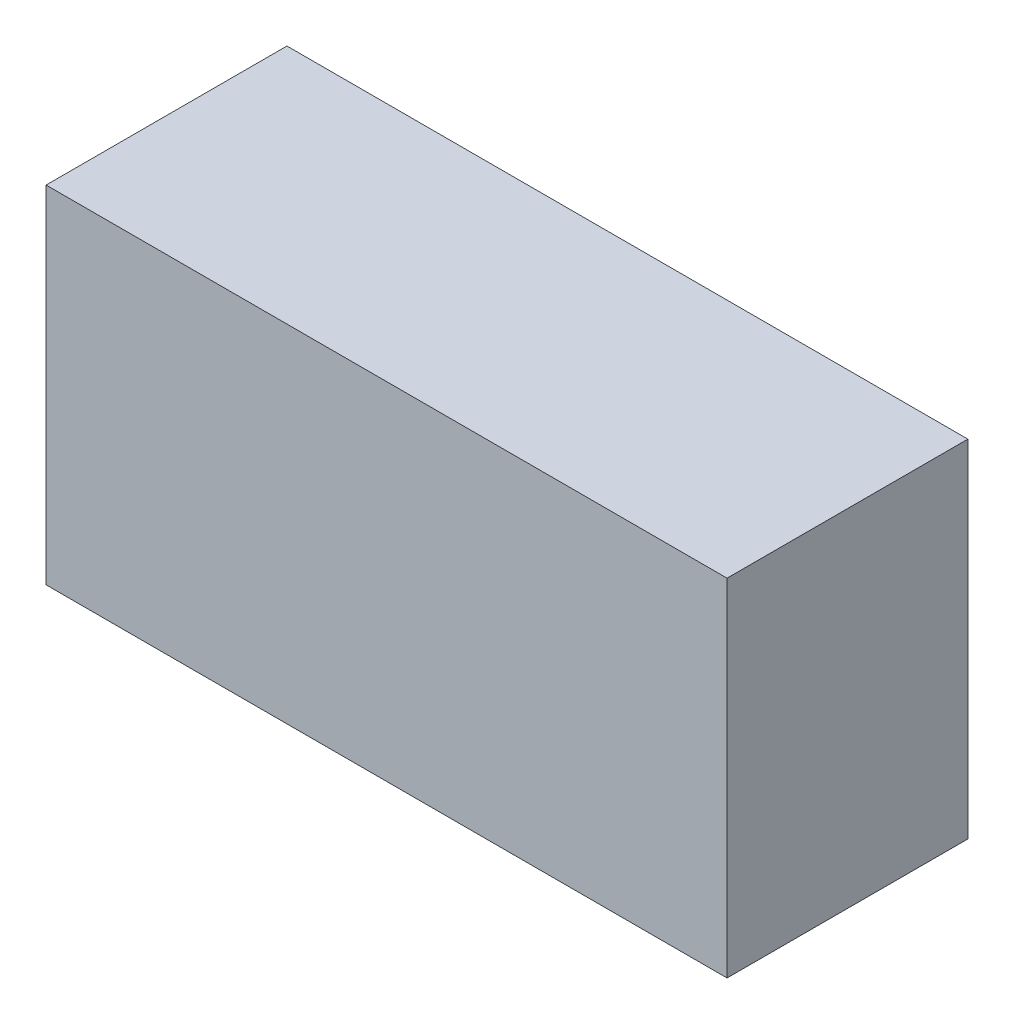
ISO-10303-21;
HEADER;
FILE_DESCRIPTION(('STEP AP214'),'2;1');
FILE_NAME('part.step','',(''),(''),'','','');
FILE_SCHEMA(('AUTOMOTIVE_DESIGN { 1 0 10303 214 1 1 1 1 }'));
ENDSEC;
DATA;
#1=APPLICATION_CONTEXT('core data for automotive mechanical design processes');
#2=APPLICATION_PROTOCOL_DEFINITION('international standard','automotive_design',2000,#1);
#3=PRODUCT_CONTEXT('',#1,'mechanical');
#4=PRODUCT('Part','Part','',(#3));
#5=PRODUCT_RELATED_PRODUCT_CATEGORY('part','',(#4));
#6=PRODUCT_DEFINITION_FORMATION('','',#4);
#7=PRODUCT_DEFINITION_CONTEXT('part definition',#1,'design');
#8=PRODUCT_DEFINITION('design','',#6,#7);
#9=PRODUCT_DEFINITION_SHAPE('','',#8);
#10=(LENGTH_UNIT() NAMED_UNIT(*) SI_UNIT(.MILLI.,.METRE.));
#11=(NAMED_UNIT(*) PLANE_ANGLE_UNIT() SI_UNIT($,.RADIAN.));
#12=(NAMED_UNIT(*) SI_UNIT($,.STERADIAN.) SOLID_ANGLE_UNIT());
#13=UNCERTAINTY_MEASURE_WITH_UNIT(LENGTH_MEASURE(1.E-05),#10,'distance_accuracy_value','');
#14=(GEOMETRIC_REPRESENTATION_CONTEXT(3) GLOBAL_UNCERTAINTY_ASSIGNED_CONTEXT((#13)) GLOBAL_UNIT_ASSIGNED_CONTEXT((#10,
#11,#12)) REPRESENTATION_CONTEXT('',''));
#15=CARTESIAN_POINT('',(0.,0.,0.));
#16=DIRECTION('',(0.,0.,1.));
#17=DIRECTION('',(1.,0.,0.));
#18=AXIS2_PLACEMENT_3D('',#15,#16,#17);
#19=CARTESIAN_POINT('',(0.,41.7,0.));
#20=DIRECTION('',(1.,0.,0.));
#21=DIRECTION('',(0.,0.,-1.));
#22=AXIS2_PLACEMENT_3D('',#19,#20,#21);
#23=PLANE('',#22);
#24=DIRECTION('',(0.,0.,1.));
#25=VECTOR('',#24,1.);
#26=CARTESIAN_POINT('',(0.,0.,0.));
#27=LINE('',#26,#25);
#28=CARTESIAN_POINT('',(0.,0.,-29.));
#29=VERTEX_POINT('',#28);
#30=CARTESIAN_POINT('',(0.,0.,0.));
#31=VERTEX_POINT('',#30);
#32=EDGE_CURVE('E113',#29,#31,#27,.T.);
#33=ORIENTED_EDGE('',*,*,#32,.T.);
#34=DIRECTION('',(0.,-1.,0.));
#35=VECTOR('',#34,1.);
#36=CARTESIAN_POINT('',(0.,41.7,0.));
#37=LINE('',#36,#35);
#38=CARTESIAN_POINT('',(0.,41.7,0.));
#39=VERTEX_POINT('',#38);
#40=EDGE_CURVE('E11',#39,#31,#37,.T.);
#41=ORIENTED_EDGE('',*,*,#40,.F.);
#42=DIRECTION('',(0.,0.,1.));
#43=VECTOR('',#42,1.);
#44=CARTESIAN_POINT('',(0.,41.7,0.));
#45=LINE('',#44,#43);
#46=CARTESIAN_POINT('',(0.,41.7,-29.));
#47=VERTEX_POINT('',#46);
#48=EDGE_CURVE('E97',#47,#39,#45,.T.);
#49=ORIENTED_EDGE('',*,*,#48,.F.);
#50=DIRECTION('',(0.,-1.,0.));
#51=VECTOR('',#50,1.);
#52=CARTESIAN_POINT('',(0.,41.7,-29.));
#53=LINE('',#52,#51);
#54=EDGE_CURVE('E109',#47,#29,#53,.T.);
#55=ORIENTED_EDGE('',*,*,#54,.T.);
#56=EDGE_LOOP('',(#33,#41,#49,#55));
#57=FACE_BOUND('',#56,.T.);
#58=ADVANCED_FACE('F45',(#57),#23,.F.);
#59=CARTESIAN_POINT('',(0.,41.7,0.));
#60=DIRECTION('',(0.,0.,-1.));
#61=DIRECTION('',(-1.,0.,0.));
#62=AXIS2_PLACEMENT_3D('',#59,#60,#61);
#63=PLANE('',#62);
#64=DIRECTION('',(1.,0.,0.));
#65=VECTOR('',#64,1.);
#66=CARTESIAN_POINT('',(0.,0.,0.));
#67=LINE('',#66,#65);
#68=CARTESIAN_POINT('',(82.,0.,0.));
#69=VERTEX_POINT('',#68);
#70=EDGE_CURVE('E102',#31,#69,#67,.T.);
#71=ORIENTED_EDGE('',*,*,#70,.T.);
#72=DIRECTION('',(0.,-1.,0.));
#73=VECTOR('',#72,1.);
#74=CARTESIAN_POINT('',(82.,41.7,0.));
#75=LINE('',#74,#73);
#76=CARTESIAN_POINT('',(82.,41.7,0.));
#77=VERTEX_POINT('',#76);
#78=EDGE_CURVE('E54',#77,#69,#75,.T.);
#79=ORIENTED_EDGE('',*,*,#78,.F.);
#80=DIRECTION('',(1.,0.,0.));
#81=VECTOR('',#80,1.);
#82=CARTESIAN_POINT('',(0.,41.7,0.));
#83=LINE('',#82,#81);
#84=EDGE_CURVE('E92',#39,#77,#83,.T.);
#85=ORIENTED_EDGE('',*,*,#84,.F.);
#86=ORIENTED_EDGE('',*,*,#40,.T.);
#87=EDGE_LOOP('',(#71,#79,#85,#86));
#88=FACE_BOUND('',#87,.T.);
#89=ADVANCED_FACE('F101',(#88),#63,.F.);
#90=CARTESIAN_POINT('',(82.,41.7,0.));
#91=DIRECTION('',(-1.,0.,0.));
#92=DIRECTION('',(0.,0.,1.));
#93=AXIS2_PLACEMENT_3D('',#90,#91,#92);
#94=PLANE('',#93);
#95=DIRECTION('',(0.,0.,-1.));
#96=VECTOR('',#95,1.);
#97=CARTESIAN_POINT('',(82.,0.,0.));
#98=LINE('',#97,#96);
#99=CARTESIAN_POINT('',(82.,0.,-29.));
#100=VERTEX_POINT('',#99);
#101=EDGE_CURVE('E79',#69,#100,#98,.T.);
#102=ORIENTED_EDGE('',*,*,#101,.T.);
#103=DIRECTION('',(0.,-1.,0.));
#104=VECTOR('',#103,1.);
#105=CARTESIAN_POINT('',(82.,41.7,-29.));
#106=LINE('',#105,#104);
#107=CARTESIAN_POINT('',(82.,41.7,-29.));
#108=VERTEX_POINT('',#107);
#109=EDGE_CURVE('E104',#108,#100,#106,.T.);
#110=ORIENTED_EDGE('',*,*,#109,.F.);
#111=DIRECTION('',(0.,0.,-1.));
#112=VECTOR('',#111,1.);
#113=CARTESIAN_POINT('',(82.,41.7,0.));
#114=LINE('',#113,#112);
#115=EDGE_CURVE('E95',#77,#108,#114,.T.);
#116=ORIENTED_EDGE('',*,*,#115,.F.);
#117=ORIENTED_EDGE('',*,*,#78,.T.);
#118=EDGE_LOOP('',(#102,#110,#116,#117));
#119=FACE_BOUND('',#118,.T.);
#120=ADVANCED_FACE('F105',(#119),#94,.F.);
#121=CARTESIAN_POINT('',(0.,41.7,-29.));
#122=DIRECTION('',(0.,0.,1.));
#123=DIRECTION('',(1.,0.,0.));
#124=AXIS2_PLACEMENT_3D('',#121,#122,#123);
#125=PLANE('',#124);
#126=DIRECTION('',(-1.,0.,0.));
#127=VECTOR('',#126,1.);
#128=CARTESIAN_POINT('',(0.,0.,-29.));
#129=LINE('',#128,#127);
#130=EDGE_CURVE('E85',#100,#29,#129,.T.);
#131=ORIENTED_EDGE('',*,*,#130,.T.);
#132=ORIENTED_EDGE('',*,*,#54,.F.);
#133=DIRECTION('',(-1.,0.,0.));
#134=VECTOR('',#133,1.);
#135=CARTESIAN_POINT('',(0.,41.7,-29.));
#136=LINE('',#135,#134);
#137=EDGE_CURVE('E62',#108,#47,#136,.T.);
#138=ORIENTED_EDGE('',*,*,#137,.F.);
#139=ORIENTED_EDGE('',*,*,#109,.T.);
#140=EDGE_LOOP('',(#131,#132,#138,#139));
#141=FACE_BOUND('',#140,.T.);
#142=ADVANCED_FACE('F126',(#141),#125,.F.);
#143=CARTESIAN_POINT('',(0.,41.7,0.));
#144=DIRECTION('',(0.,-1.,0.));
#145=DIRECTION('',(0.,0.,-1.));
#146=AXIS2_PLACEMENT_3D('',#143,#144,#145);
#147=PLANE('',#146);
#148=ORIENTED_EDGE('',*,*,#48,.T.);
#149=ORIENTED_EDGE('',*,*,#84,.T.);
#150=ORIENTED_EDGE('',*,*,#115,.T.);
#151=ORIENTED_EDGE('',*,*,#137,.T.);
#152=EDGE_LOOP('',(#148,#149,#150,#151));
#153=FACE_BOUND('',#152,.T.);
#154=ADVANCED_FACE('F93',(#153),#147,.F.);
#155=CARTESIAN_POINT('',(0.,0.,0.));
#156=DIRECTION('',(0.,-1.,0.));
#157=DIRECTION('',(0.,0.,-1.));
#158=AXIS2_PLACEMENT_3D('',#155,#156,#157);
#159=PLANE('',#158);
#160=ORIENTED_EDGE('',*,*,#32,.F.);
#161=ORIENTED_EDGE('',*,*,#130,.F.);
#162=ORIENTED_EDGE('',*,*,#101,.F.);
#163=ORIENTED_EDGE('',*,*,#70,.F.);
#164=EDGE_LOOP('',(#160,#161,#162,#163));
#165=FACE_BOUND('',#164,.T.);
#166=ADVANCED_FACE('F129',(#165),#159,.T.);
#167=CLOSED_SHELL('',(#58,#89,#120,#142,#154,#166));
#168=MANIFOLD_SOLID_BREP('B2',#167);
#169=ADVANCED_BREP_SHAPE_REPRESENTATION('',(#18,#168),#14);
#170=SHAPE_DEFINITION_REPRESENTATION(#9,#169);
ENDSEC;
END-ISO-10303-21;
